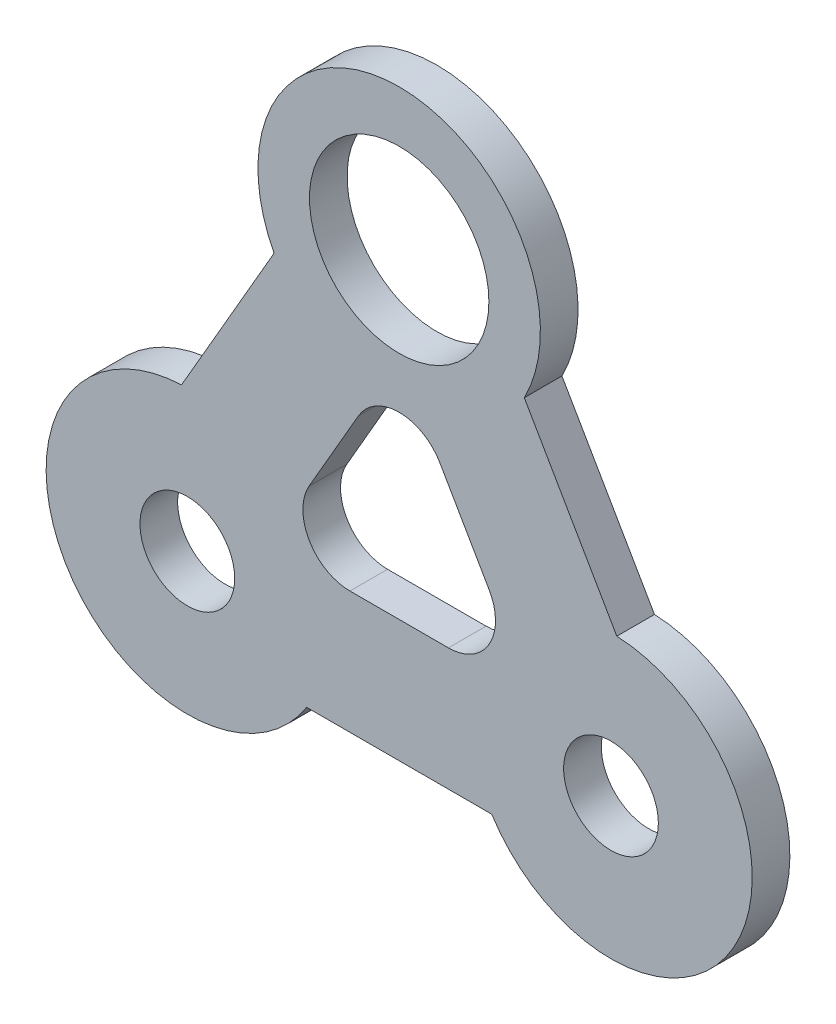
ISO-10303-21;
HEADER;
FILE_DESCRIPTION(('STEP AP214'),'2;1');
FILE_NAME('part.step','',(''),(''),'','','');
FILE_SCHEMA(('AUTOMOTIVE_DESIGN { 1 0 10303 214 1 1 1 1 }'));
ENDSEC;
DATA;
#1=APPLICATION_CONTEXT('core data for automotive mechanical design processes');
#2=APPLICATION_PROTOCOL_DEFINITION('international standard','automotive_design',2000,#1);
#3=PRODUCT_CONTEXT('',#1,'mechanical');
#4=PRODUCT('Part','Part','',(#3));
#5=PRODUCT_RELATED_PRODUCT_CATEGORY('part','',(#4));
#6=PRODUCT_DEFINITION_FORMATION('','',#4);
#7=PRODUCT_DEFINITION_CONTEXT('part definition',#1,'design');
#8=PRODUCT_DEFINITION('design','',#6,#7);
#9=PRODUCT_DEFINITION_SHAPE('','',#8);
#10=(LENGTH_UNIT() NAMED_UNIT(*) SI_UNIT(.MILLI.,.METRE.));
#11=(NAMED_UNIT(*) PLANE_ANGLE_UNIT() SI_UNIT($,.RADIAN.));
#12=(NAMED_UNIT(*) SI_UNIT($,.STERADIAN.) SOLID_ANGLE_UNIT());
#13=UNCERTAINTY_MEASURE_WITH_UNIT(LENGTH_MEASURE(1.E-05),#10,'distance_accuracy_value','');
#14=(GEOMETRIC_REPRESENTATION_CONTEXT(3) GLOBAL_UNCERTAINTY_ASSIGNED_CONTEXT((#13)) GLOBAL_UNIT_ASSIGNED_CONTEXT((#10,
#11,#12)) REPRESENTATION_CONTEXT('',''));
#15=CARTESIAN_POINT('',(0.,0.,0.));
#16=DIRECTION('',(0.,0.,1.));
#17=DIRECTION('',(1.,0.,0.));
#18=AXIS2_PLACEMENT_3D('',#15,#16,#17);
#19=CARTESIAN_POINT('',(-0.291428571428643,20.2141430137214,4.));
#20=DIRECTION('',(0.,0.,1.));
#21=DIRECTION('',(1.,0.,0.));
#22=AXIS2_PLACEMENT_3D('',#19,#20,#21);
#23=PLANE('',#22);
#24=CARTESIAN_POINT('',(22.2085714285714,-18.7570001565784,4.));
#25=DIRECTION('',(0.,0.,1.));
#26=DIRECTION('',(1.,0.,0.));
#27=AXIS2_PLACEMENT_3D('',#24,#25,#26);
#28=CIRCLE('',#27,5.03);
#29=CARTESIAN_POINT('',(27.2385714285714,-18.7570001565784,4.));
#30=VERTEX_POINT('',#29);
#31=EDGE_CURVE('E206',#30,#30,#28,.T.);
#32=ORIENTED_EDGE('',*,*,#31,.F.);
#33=EDGE_LOOP('',(#32));
#34=FACE_BOUND('',#33,.T.);
#35=DIRECTION('',(-0.500000000000004,-0.866025403784436,0.));
#36=VECTOR('',#35,1.);
#37=CARTESIAN_POINT('',(-18.4946225492973,4.74299984342158,4.));
#38=LINE('',#37,#36);
#39=CARTESIAN_POINT('',(-13.579791410665,13.2557370861542,4.));
#40=VERTEX_POINT('',#39);
#41=CARTESIAN_POINT('',(-23.4094536879295,-3.76973739931099,4.));
#42=VERTEX_POINT('',#41);
#43=EDGE_CURVE('E222',#40,#42,#38,.T.);
#44=ORIENTED_EDGE('',*,*,#43,.T.);
#45=CARTESIAN_POINT('',(-22.7914285714286,-18.7570001565784,4.));
#46=DIRECTION('',(0.,0.,1.));
#47=DIRECTION('',(-1.,0.,0.));
#48=AXIS2_PLACEMENT_3D('',#45,#46,#47);
#49=CIRCLE('',#48,15.);
#50=CARTESIAN_POINT('',(-10.1210908486931,-26.7858569862786,4.));
#51=VERTEX_POINT('',#50);
#52=EDGE_CURVE('E225',#42,#51,#49,.T.);
#53=ORIENTED_EDGE('',*,*,#52,.T.);
#54=DIRECTION('',(1.,0.,0.));
#55=VECTOR('',#54,1.);
#56=CARTESIAN_POINT('',(-0.291428571428633,-26.7858569862786,4.));
#57=LINE('',#56,#55);
#58=CARTESIAN_POINT('',(9.53823370583582,-26.7858569862786,4.));
#59=VERTEX_POINT('',#58);
#60=EDGE_CURVE('E229',#51,#59,#57,.T.);
#61=ORIENTED_EDGE('',*,*,#60,.T.);
#62=CARTESIAN_POINT('',(22.2085714285715,-18.7570001565784,4.));
#63=DIRECTION('',(0.,0.,1.));
#64=DIRECTION('',(-1.,0.,0.));
#65=AXIS2_PLACEMENT_3D('',#62,#63,#64);
#66=CIRCLE('',#65,15.0000000000001);
#67=CARTESIAN_POINT('',(22.8265965450723,-3.76973739931098,4.));
#68=VERTEX_POINT('',#67);
#69=EDGE_CURVE('E232',#59,#68,#66,.T.);
#70=ORIENTED_EDGE('',*,*,#69,.T.);
#71=DIRECTION('',(-0.500000000000005,0.866025403784436,0.));
#72=VECTOR('',#71,1.);
#73=CARTESIAN_POINT('',(17.91176540644,4.74299984342158,4.));
#74=LINE('',#73,#72);
#75=CARTESIAN_POINT('',(12.9969342678077,13.2557370861542,4.));
#76=VERTEX_POINT('',#75);
#77=EDGE_CURVE('E235',#68,#76,#74,.T.);
#78=ORIENTED_EDGE('',*,*,#77,.T.);
#79=CARTESIAN_POINT('',(-0.291428571428643,20.2141430137214,4.));
#80=DIRECTION('',(0.,0.,1.));
#81=DIRECTION('',(1.,0.,0.));
#82=AXIS2_PLACEMENT_3D('',#79,#80,#81);
#83=CIRCLE('',#82,15.);
#84=EDGE_CURVE('E238',#76,#40,#83,.T.);
#85=ORIENTED_EDGE('',*,*,#84,.T.);
#86=EDGE_LOOP('',(#44,#53,#61,#70,#78,#85));
#87=FACE_BOUND('',#86,.T.);
#88=CARTESIAN_POINT('',(-0.29142857142864,20.2141430137214,4.));
#89=DIRECTION('',(0.,0.,1.));
#90=DIRECTION('',(1.,0.,0.));
#91=AXIS2_PLACEMENT_3D('',#88,#89,#90);
#92=CIRCLE('',#91,9.53);
#93=CARTESIAN_POINT('',(9.23857142857136,20.2141430137214,4.));
#94=VERTEX_POINT('',#93);
#95=EDGE_CURVE('E214',#94,#94,#92,.T.);
#96=ORIENTED_EDGE('',*,*,#95,.F.);
#97=EDGE_LOOP('',(#96));
#98=FACE_BOUND('',#97,.T.);
#99=CARTESIAN_POINT('',(-22.7914285714286,-18.7570001565784,4.));
#100=DIRECTION('',(0.,0.,1.));
#101=DIRECTION('',(1.,0.,0.));
#102=AXIS2_PLACEMENT_3D('',#99,#100,#101);
#103=CIRCLE('',#102,5.03);
#104=CARTESIAN_POINT('',(-17.7614285714286,-18.7570001565784,4.));
#105=VERTEX_POINT('',#104);
#106=EDGE_CURVE('E198',#105,#105,#103,.T.);
#107=ORIENTED_EDGE('',*,*,#106,.F.);
#108=EDGE_LOOP('',(#107));
#109=FACE_BOUND('',#108,.T.);
#110=DIRECTION('',(-0.500000000000004,0.866025403784436,0.));
#111=VECTOR('',#110,1.);
#112=CARTESIAN_POINT('',(9.26817186699101,-6.28585698627862,4.));
#113=LINE('',#112,#111);
#114=CARTESIAN_POINT('',(9.26817186699101,-6.28585698627862,4.));
#115=VERTEX_POINT('',#114);
#116=CARTESIAN_POINT('',(4.03869844749354,2.77185667312186,4.));
#117=VERTEX_POINT('',#116);
#118=EDGE_CURVE('E138',#115,#117,#113,.T.);
#119=ORIENTED_EDGE('',*,*,#118,.F.);
#120=CARTESIAN_POINT('',(4.9380448480688,-8.78585698627862,4.));
#121=DIRECTION('',(0.,0.,1.));
#122=DIRECTION('',(1.,0.,0.));
#123=AXIS2_PLACEMENT_3D('',#120,#121,#122);
#124=CIRCLE('',#123,5.00000000000002);
#125=CARTESIAN_POINT('',(4.93804484806883,-13.7858569862786,4.));
#126=VERTEX_POINT('',#125);
#127=EDGE_CURVE('E129',#126,#115,#124,.T.);
#128=ORIENTED_EDGE('',*,*,#127,.F.);
#129=DIRECTION('',(1.,0.,0.));
#130=VECTOR('',#129,1.);
#131=CARTESIAN_POINT('',(4.93804484806883,-13.7858569862786,4.));
#132=LINE('',#131,#130);
#133=CARTESIAN_POINT('',(-5.52090199092611,-13.7858569862786,4.));
#134=VERTEX_POINT('',#133);
#135=EDGE_CURVE('E164',#134,#126,#132,.T.);
#136=ORIENTED_EDGE('',*,*,#135,.F.);
#137=CARTESIAN_POINT('',(-5.5209019909261,-8.78585698627863,4.));
#138=DIRECTION('',(0.,0.,1.));
#139=DIRECTION('',(-1.,0.,0.));
#140=AXIS2_PLACEMENT_3D('',#137,#138,#139);
#141=CIRCLE('',#140,5.);
#142=CARTESIAN_POINT('',(-9.85102900984829,-6.28585698627862,4.));
#143=VERTEX_POINT('',#142);
#144=EDGE_CURVE('E161',#143,#134,#141,.T.);
#145=ORIENTED_EDGE('',*,*,#144,.F.);
#146=DIRECTION('',(-0.500000000000004,-0.866025403784436,0.));
#147=VECTOR('',#146,1.);
#148=CARTESIAN_POINT('',(-4.62155559035082,2.77185667312185,4.));
#149=LINE('',#148,#147);
#150=CARTESIAN_POINT('',(-4.62155559035083,2.77185667312185,4.));
#151=VERTEX_POINT('',#150);
#152=EDGE_CURVE('E156',#151,#143,#149,.T.);
#153=ORIENTED_EDGE('',*,*,#152,.F.);
#154=CARTESIAN_POINT('',(-0.291428571428639,0.271856673121823,4.));
#155=DIRECTION('',(0.,0.,1.));
#156=DIRECTION('',(1.,0.,0.));
#157=AXIS2_PLACEMENT_3D('',#154,#155,#156);
#158=CIRCLE('',#157,5.00000000000001);
#159=EDGE_CURVE('E152',#117,#151,#158,.T.);
#160=ORIENTED_EDGE('',*,*,#159,.F.);
#161=EDGE_LOOP('',(#119,#128,#136,#145,#153,#160));
#162=FACE_BOUND('',#161,.T.);
#163=ADVANCED_FACE('F39',(#34,#87,#98,#109,#162),#23,.T.);
#164=CARTESIAN_POINT('',(-0.291428571428643,20.2141430137214,0.));
#165=DIRECTION('',(0.,0.,1.));
#166=DIRECTION('',(1.,0.,0.));
#167=AXIS2_PLACEMENT_3D('',#164,#165,#166);
#168=PLANE('',#167);
#169=CARTESIAN_POINT('',(-22.7914285714286,-18.7570001565784,0.));
#170=DIRECTION('',(0.,0.,1.));
#171=DIRECTION('',(1.,0.,0.));
#172=AXIS2_PLACEMENT_3D('',#169,#170,#171);
#173=CIRCLE('',#172,5.03);
#174=CARTESIAN_POINT('',(-17.7614285714286,-18.7570001565784,0.));
#175=VERTEX_POINT('',#174);
#176=EDGE_CURVE('E147',#175,#175,#173,.T.);
#177=ORIENTED_EDGE('',*,*,#176,.T.);
#178=EDGE_LOOP('',(#177));
#179=FACE_BOUND('',#178,.T.);
#180=CARTESIAN_POINT('',(22.2085714285714,-18.7570001565784,0.));
#181=DIRECTION('',(0.,0.,1.));
#182=DIRECTION('',(1.,0.,0.));
#183=AXIS2_PLACEMENT_3D('',#180,#181,#182);
#184=CIRCLE('',#183,5.03);
#185=CARTESIAN_POINT('',(27.2385714285714,-18.7570001565784,0.));
#186=VERTEX_POINT('',#185);
#187=EDGE_CURVE('E202',#186,#186,#184,.T.);
#188=ORIENTED_EDGE('',*,*,#187,.T.);
#189=EDGE_LOOP('',(#188));
#190=FACE_BOUND('',#189,.T.);
#191=CARTESIAN_POINT('',(-0.29142857142864,20.2141430137214,0.));
#192=DIRECTION('',(0.,0.,1.));
#193=DIRECTION('',(1.,0.,0.));
#194=AXIS2_PLACEMENT_3D('',#191,#192,#193);
#195=CIRCLE('',#194,9.53);
#196=CARTESIAN_POINT('',(9.23857142857136,20.2141430137214,0.));
#197=VERTEX_POINT('',#196);
#198=EDGE_CURVE('E210',#197,#197,#195,.T.);
#199=ORIENTED_EDGE('',*,*,#198,.T.);
#200=EDGE_LOOP('',(#199));
#201=FACE_BOUND('',#200,.T.);
#202=DIRECTION('',(-0.500000000000004,-0.866025403784436,0.));
#203=VECTOR('',#202,1.);
#204=CARTESIAN_POINT('',(-18.4946225492973,4.74299984342158,0.));
#205=LINE('',#204,#203);
#206=CARTESIAN_POINT('',(-13.579791410665,13.2557370861542,0.));
#207=VERTEX_POINT('',#206);
#208=CARTESIAN_POINT('',(-23.4094536879295,-3.76973739931099,0.));
#209=VERTEX_POINT('',#208);
#210=EDGE_CURVE('E218',#207,#209,#205,.T.);
#211=ORIENTED_EDGE('',*,*,#210,.F.);
#212=CARTESIAN_POINT('',(-0.291428571428643,20.2141430137214,0.));
#213=DIRECTION('',(0.,0.,1.));
#214=DIRECTION('',(1.,0.,0.));
#215=AXIS2_PLACEMENT_3D('',#212,#213,#214);
#216=CIRCLE('',#215,15.);
#217=CARTESIAN_POINT('',(12.9969342678077,13.2557370861542,0.));
#218=VERTEX_POINT('',#217);
#219=EDGE_CURVE('E226',#218,#207,#216,.T.);
#220=ORIENTED_EDGE('',*,*,#219,.F.);
#221=DIRECTION('',(-0.500000000000005,0.866025403784436,0.));
#222=VECTOR('',#221,1.);
#223=CARTESIAN_POINT('',(17.91176540644,4.74299984342158,0.));
#224=LINE('',#223,#222);
#225=CARTESIAN_POINT('',(22.8265965450723,-3.76973739931098,0.));
#226=VERTEX_POINT('',#225);
#227=EDGE_CURVE('E255',#226,#218,#224,.T.);
#228=ORIENTED_EDGE('',*,*,#227,.F.);
#229=CARTESIAN_POINT('',(22.2085714285715,-18.7570001565784,0.));
#230=DIRECTION('',(0.,0.,1.));
#231=DIRECTION('',(-1.,0.,0.));
#232=AXIS2_PLACEMENT_3D('',#229,#230,#231);
#233=CIRCLE('',#232,15.0000000000001);
#234=CARTESIAN_POINT('',(9.53823370583582,-26.7858569862786,0.));
#235=VERTEX_POINT('',#234);
#236=EDGE_CURVE('E251',#235,#226,#233,.T.);
#237=ORIENTED_EDGE('',*,*,#236,.F.);
#238=DIRECTION('',(1.,0.,0.));
#239=VECTOR('',#238,1.);
#240=CARTESIAN_POINT('',(-0.291428571428633,-26.7858569862786,0.));
#241=LINE('',#240,#239);
#242=CARTESIAN_POINT('',(-10.1210908486931,-26.7858569862786,0.));
#243=VERTEX_POINT('',#242);
#244=EDGE_CURVE('E248',#243,#235,#241,.T.);
#245=ORIENTED_EDGE('',*,*,#244,.F.);
#246=CARTESIAN_POINT('',(-22.7914285714286,-18.7570001565784,0.));
#247=DIRECTION('',(0.,0.,1.));
#248=DIRECTION('',(-1.,0.,0.));
#249=AXIS2_PLACEMENT_3D('',#246,#247,#248);
#250=CIRCLE('',#249,15.);
#251=EDGE_CURVE('E244',#209,#243,#250,.T.);
#252=ORIENTED_EDGE('',*,*,#251,.F.);
#253=EDGE_LOOP('',(#211,#220,#228,#237,#245,#252));
#254=FACE_BOUND('',#253,.T.);
#255=CARTESIAN_POINT('',(4.9380448480688,-8.78585698627862,0.));
#256=DIRECTION('',(0.,0.,1.));
#257=DIRECTION('',(1.,0.,0.));
#258=AXIS2_PLACEMENT_3D('',#255,#256,#257);
#259=CIRCLE('',#258,5.00000000000002);
#260=CARTESIAN_POINT('',(4.93804484806883,-13.7858569862786,0.));
#261=VERTEX_POINT('',#260);
#262=CARTESIAN_POINT('',(9.26817186699101,-6.28585698627862,0.));
#263=VERTEX_POINT('',#262);
#264=EDGE_CURVE('E63',#261,#263,#259,.T.);
#265=ORIENTED_EDGE('',*,*,#264,.T.);
#266=DIRECTION('',(-0.500000000000004,0.866025403784436,0.));
#267=VECTOR('',#266,1.);
#268=CARTESIAN_POINT('',(9.26817186699101,-6.28585698627862,0.));
#269=LINE('',#268,#267);
#270=CARTESIAN_POINT('',(4.03869844749354,2.77185667312186,0.));
#271=VERTEX_POINT('',#270);
#272=EDGE_CURVE('E145',#263,#271,#269,.T.);
#273=ORIENTED_EDGE('',*,*,#272,.T.);
#274=CARTESIAN_POINT('',(-0.291428571428639,0.271856673121823,0.));
#275=DIRECTION('',(0.,0.,1.));
#276=DIRECTION('',(1.,0.,0.));
#277=AXIS2_PLACEMENT_3D('',#274,#275,#276);
#278=CIRCLE('',#277,5.00000000000001);
#279=CARTESIAN_POINT('',(-4.62155559035083,2.77185667312185,0.));
#280=VERTEX_POINT('',#279);
#281=EDGE_CURVE('E171',#271,#280,#278,.T.);
#282=ORIENTED_EDGE('',*,*,#281,.T.);
#283=DIRECTION('',(-0.500000000000004,-0.866025403784436,0.));
#284=VECTOR('',#283,1.);
#285=CARTESIAN_POINT('',(-4.62155559035082,2.77185667312185,0.));
#286=LINE('',#285,#284);
#287=CARTESIAN_POINT('',(-9.85102900984829,-6.28585698627862,0.));
#288=VERTEX_POINT('',#287);
#289=EDGE_CURVE('E175',#280,#288,#286,.T.);
#290=ORIENTED_EDGE('',*,*,#289,.T.);
#291=CARTESIAN_POINT('',(-5.5209019909261,-8.78585698627863,0.));
#292=DIRECTION('',(0.,0.,1.));
#293=DIRECTION('',(-1.,0.,0.));
#294=AXIS2_PLACEMENT_3D('',#291,#292,#293);
#295=CIRCLE('',#294,5.);
#296=CARTESIAN_POINT('',(-5.52090199092611,-13.7858569862786,0.));
#297=VERTEX_POINT('',#296);
#298=EDGE_CURVE('E179',#288,#297,#295,.T.);
#299=ORIENTED_EDGE('',*,*,#298,.T.);
#300=DIRECTION('',(1.,0.,0.));
#301=VECTOR('',#300,1.);
#302=CARTESIAN_POINT('',(4.93804484806883,-13.7858569862786,0.));
#303=LINE('',#302,#301);
#304=EDGE_CURVE('E139',#297,#261,#303,.T.);
#305=ORIENTED_EDGE('',*,*,#304,.T.);
#306=EDGE_LOOP('',(#265,#273,#282,#290,#299,#305));
#307=FACE_BOUND('',#306,.T.);
#308=ADVANCED_FACE('F288',(#179,#190,#201,#254,#307),#168,.F.);
#309=CARTESIAN_POINT('',(-18.4946225492973,4.74299984342158,4.));
#310=DIRECTION('',(0.866025403784436,-0.500000000000004,0.));
#311=DIRECTION('',(0.500000000000004,0.866025403784436,0.));
#312=AXIS2_PLACEMENT_3D('',#309,#310,#311);
#313=PLANE('',#312);
#314=ORIENTED_EDGE('',*,*,#210,.T.);
#315=DIRECTION('',(0.,0.,-1.));
#316=VECTOR('',#315,1.);
#317=CARTESIAN_POINT('',(-23.4094536879295,-3.76973739931099,4.));
#318=LINE('',#317,#316);
#319=EDGE_CURVE('E11',#42,#209,#318,.T.);
#320=ORIENTED_EDGE('',*,*,#319,.F.);
#321=ORIENTED_EDGE('',*,*,#43,.F.);
#322=DIRECTION('',(0.,0.,-1.));
#323=VECTOR('',#322,1.);
#324=CARTESIAN_POINT('',(-13.579791410665,13.2557370861542,4.));
#325=LINE('',#324,#323);
#326=EDGE_CURVE('E241',#40,#207,#325,.T.);
#327=ORIENTED_EDGE('',*,*,#326,.T.);
#328=EDGE_LOOP('',(#314,#320,#321,#327));
#329=FACE_BOUND('',#328,.T.);
#330=ADVANCED_FACE('F41',(#329),#313,.F.);
#331=CARTESIAN_POINT('',(-22.7914285714286,-18.7570001565784,4.));
#332=DIRECTION('',(0.,0.,-1.));
#333=DIRECTION('',(-1.,0.,0.));
#334=AXIS2_PLACEMENT_3D('',#331,#332,#333);
#335=CYLINDRICAL_SURFACE('',#334,15.);
#336=ORIENTED_EDGE('',*,*,#251,.T.);
#337=DIRECTION('',(0.,0.,-1.));
#338=VECTOR('',#337,1.);
#339=CARTESIAN_POINT('',(-10.1210908486931,-26.7858569862786,4.));
#340=LINE('',#339,#338);
#341=EDGE_CURVE('E48',#51,#243,#340,.T.);
#342=ORIENTED_EDGE('',*,*,#341,.F.);
#343=ORIENTED_EDGE('',*,*,#52,.F.);
#344=ORIENTED_EDGE('',*,*,#319,.T.);
#345=EDGE_LOOP('',(#336,#342,#343,#344));
#346=FACE_BOUND('',#345,.T.);
#347=ADVANCED_FACE('F284',(#346),#335,.T.);
#348=CARTESIAN_POINT('',(-0.291428571428633,-26.7858569862786,4.));
#349=DIRECTION('',(0.,1.,0.));
#350=DIRECTION('',(0.,0.,1.));
#351=AXIS2_PLACEMENT_3D('',#348,#349,#350);
#352=PLANE('',#351);
#353=ORIENTED_EDGE('',*,*,#244,.T.);
#354=DIRECTION('',(0.,0.,-1.));
#355=VECTOR('',#354,1.);
#356=CARTESIAN_POINT('',(9.53823370583582,-26.7858569862786,4.));
#357=LINE('',#356,#355);
#358=EDGE_CURVE('E272',#59,#235,#357,.T.);
#359=ORIENTED_EDGE('',*,*,#358,.F.);
#360=ORIENTED_EDGE('',*,*,#60,.F.);
#361=ORIENTED_EDGE('',*,*,#341,.T.);
#362=EDGE_LOOP('',(#353,#359,#360,#361));
#363=FACE_BOUND('',#362,.T.);
#364=ADVANCED_FACE('F280',(#363),#352,.F.);
#365=CARTESIAN_POINT('',(22.2085714285715,-18.7570001565784,4.));
#366=DIRECTION('',(0.,0.,-1.));
#367=DIRECTION('',(-1.,0.,0.));
#368=AXIS2_PLACEMENT_3D('',#365,#366,#367);
#369=CYLINDRICAL_SURFACE('',#368,15.0000000000001);
#370=ORIENTED_EDGE('',*,*,#236,.T.);
#371=DIRECTION('',(0.,0.,-1.));
#372=VECTOR('',#371,1.);
#373=CARTESIAN_POINT('',(22.8265965450723,-3.76973739931098,4.));
#374=LINE('',#373,#372);
#375=EDGE_CURVE('E268',#68,#226,#374,.T.);
#376=ORIENTED_EDGE('',*,*,#375,.F.);
#377=ORIENTED_EDGE('',*,*,#69,.F.);
#378=ORIENTED_EDGE('',*,*,#358,.T.);
#379=EDGE_LOOP('',(#370,#376,#377,#378));
#380=FACE_BOUND('',#379,.T.);
#381=ADVANCED_FACE('F294',(#380),#369,.T.);
#382=CARTESIAN_POINT('',(17.91176540644,4.74299984342158,4.));
#383=DIRECTION('',(-0.866025403784436,-0.500000000000005,0.));
#384=DIRECTION('',(0.500000000000005,-0.866025403784436,0.));
#385=AXIS2_PLACEMENT_3D('',#382,#383,#384);
#386=PLANE('',#385);
#387=ORIENTED_EDGE('',*,*,#227,.T.);
#388=DIRECTION('',(0.,0.,-1.));
#389=VECTOR('',#388,1.);
#390=CARTESIAN_POINT('',(12.9969342678077,13.2557370861542,4.));
#391=LINE('',#390,#389);
#392=EDGE_CURVE('E264',#76,#218,#391,.T.);
#393=ORIENTED_EDGE('',*,*,#392,.F.);
#394=ORIENTED_EDGE('',*,*,#77,.F.);
#395=ORIENTED_EDGE('',*,*,#375,.T.);
#396=EDGE_LOOP('',(#387,#393,#394,#395));
#397=FACE_BOUND('',#396,.T.);
#398=ADVANCED_FACE('F298',(#397),#386,.F.);
#399=CARTESIAN_POINT('',(-0.291428571428643,20.2141430137214,4.));
#400=DIRECTION('',(0.,0.,-1.));
#401=DIRECTION('',(-1.,0.,0.));
#402=AXIS2_PLACEMENT_3D('',#399,#400,#401);
#403=CYLINDRICAL_SURFACE('',#402,15.);
#404=ORIENTED_EDGE('',*,*,#219,.T.);
#405=ORIENTED_EDGE('',*,*,#326,.F.);
#406=ORIENTED_EDGE('',*,*,#84,.F.);
#407=ORIENTED_EDGE('',*,*,#392,.T.);
#408=EDGE_LOOP('',(#404,#405,#406,#407));
#409=FACE_BOUND('',#408,.T.);
#410=ADVANCED_FACE('F307',(#409),#403,.T.);
#411=CARTESIAN_POINT('',(-0.29142857142864,20.2141430137214,4.));
#412=DIRECTION('',(0.,0.,-1.));
#413=DIRECTION('',(-1.,0.,0.));
#414=AXIS2_PLACEMENT_3D('',#411,#412,#413);
#415=CYLINDRICAL_SURFACE('',#414,9.53);
#416=ORIENTED_EDGE('',*,*,#95,.T.);
#417=EDGE_LOOP('',(#416));
#418=FACE_BOUND('',#417,.T.);
#419=ORIENTED_EDGE('',*,*,#198,.F.);
#420=EDGE_LOOP('',(#419));
#421=FACE_BOUND('',#420,.T.);
#422=ADVANCED_FACE('F309',(#418,#421),#415,.F.);
#423=CARTESIAN_POINT('',(22.2085714285714,-18.7570001565784,4.));
#424=DIRECTION('',(0.,0.,-1.));
#425=DIRECTION('',(-1.,0.,0.));
#426=AXIS2_PLACEMENT_3D('',#423,#424,#425);
#427=CYLINDRICAL_SURFACE('',#426,5.03);
#428=ORIENTED_EDGE('',*,*,#31,.T.);
#429=EDGE_LOOP('',(#428));
#430=FACE_BOUND('',#429,.T.);
#431=ORIENTED_EDGE('',*,*,#187,.F.);
#432=EDGE_LOOP('',(#431));
#433=FACE_BOUND('',#432,.T.);
#434=ADVANCED_FACE('F315',(#430,#433),#427,.F.);
#435=CARTESIAN_POINT('',(-22.7914285714286,-18.7570001565784,4.));
#436=DIRECTION('',(0.,0.,-1.));
#437=DIRECTION('',(-1.,0.,0.));
#438=AXIS2_PLACEMENT_3D('',#435,#436,#437);
#439=CYLINDRICAL_SURFACE('',#438,5.03);
#440=ORIENTED_EDGE('',*,*,#106,.T.);
#441=EDGE_LOOP('',(#440));
#442=FACE_BOUND('',#441,.T.);
#443=ORIENTED_EDGE('',*,*,#176,.F.);
#444=EDGE_LOOP('',(#443));
#445=FACE_BOUND('',#444,.T.);
#446=ADVANCED_FACE('F331',(#442,#445),#439,.F.);
#447=CARTESIAN_POINT('',(4.9380448480688,-8.78585698627862,4.));
#448=DIRECTION('',(0.,0.,-1.));
#449=DIRECTION('',(-1.,0.,0.));
#450=AXIS2_PLACEMENT_3D('',#447,#448,#449);
#451=CYLINDRICAL_SURFACE('',#450,5.00000000000002);
#452=ORIENTED_EDGE('',*,*,#264,.F.);
#453=DIRECTION('',(0.,0.,-1.));
#454=VECTOR('',#453,1.);
#455=CARTESIAN_POINT('',(4.93804484806883,-13.7858569862786,4.));
#456=LINE('',#455,#454);
#457=EDGE_CURVE('E133',#126,#261,#456,.T.);
#458=ORIENTED_EDGE('',*,*,#457,.F.);
#459=ORIENTED_EDGE('',*,*,#127,.T.);
#460=DIRECTION('',(0.,0.,-1.));
#461=VECTOR('',#460,1.);
#462=CARTESIAN_POINT('',(9.26817186699101,-6.28585698627862,4.));
#463=LINE('',#462,#461);
#464=EDGE_CURVE('E132',#115,#263,#463,.T.);
#465=ORIENTED_EDGE('',*,*,#464,.T.);
#466=EDGE_LOOP('',(#452,#458,#459,#465));
#467=FACE_BOUND('',#466,.T.);
#468=ADVANCED_FACE('F131',(#467),#451,.F.);
#469=CARTESIAN_POINT('',(9.26817186699101,-6.28585698627862,4.));
#470=DIRECTION('',(-0.866025403784436,-0.500000000000004,0.));
#471=DIRECTION('',(0.500000000000004,-0.866025403784437,0.));
#472=AXIS2_PLACEMENT_3D('',#469,#470,#471);
#473=PLANE('',#472);
#474=ORIENTED_EDGE('',*,*,#272,.F.);
#475=ORIENTED_EDGE('',*,*,#464,.F.);
#476=ORIENTED_EDGE('',*,*,#118,.T.);
#477=DIRECTION('',(0.,0.,-1.));
#478=VECTOR('',#477,1.);
#479=CARTESIAN_POINT('',(4.03869844749354,2.77185667312186,4.));
#480=LINE('',#479,#478);
#481=EDGE_CURVE('E148',#117,#271,#480,.T.);
#482=ORIENTED_EDGE('',*,*,#481,.T.);
#483=EDGE_LOOP('',(#474,#475,#476,#482));
#484=FACE_BOUND('',#483,.T.);
#485=ADVANCED_FACE('F142',(#484),#473,.T.);
#486=CARTESIAN_POINT('',(-0.291428571428639,0.271856673121823,4.));
#487=DIRECTION('',(0.,0.,-1.));
#488=DIRECTION('',(-1.,0.,0.));
#489=AXIS2_PLACEMENT_3D('',#486,#487,#488);
#490=CYLINDRICAL_SURFACE('',#489,5.00000000000001);
#491=ORIENTED_EDGE('',*,*,#281,.F.);
#492=ORIENTED_EDGE('',*,*,#481,.F.);
#493=ORIENTED_EDGE('',*,*,#159,.T.);
#494=DIRECTION('',(0.,0.,-1.));
#495=VECTOR('',#494,1.);
#496=CARTESIAN_POINT('',(-4.62155559035083,2.77185667312185,4.));
#497=LINE('',#496,#495);
#498=EDGE_CURVE('E193',#151,#280,#497,.T.);
#499=ORIENTED_EDGE('',*,*,#498,.T.);
#500=EDGE_LOOP('',(#491,#492,#493,#499));
#501=FACE_BOUND('',#500,.T.);
#502=ADVANCED_FACE('F340',(#501),#490,.F.);
#503=CARTESIAN_POINT('',(-4.62155559035082,2.77185667312185,4.));
#504=DIRECTION('',(0.866025403784436,-0.500000000000004,0.));
#505=DIRECTION('',(0.500000000000004,0.866025403784437,0.));
#506=AXIS2_PLACEMENT_3D('',#503,#504,#505);
#507=PLANE('',#506);
#508=ORIENTED_EDGE('',*,*,#289,.F.);
#509=ORIENTED_EDGE('',*,*,#498,.F.);
#510=ORIENTED_EDGE('',*,*,#152,.T.);
#511=DIRECTION('',(0.,0.,-1.));
#512=VECTOR('',#511,1.);
#513=CARTESIAN_POINT('',(-9.85102900984829,-6.28585698627862,4.));
#514=LINE('',#513,#512);
#515=EDGE_CURVE('E190',#143,#288,#514,.T.);
#516=ORIENTED_EDGE('',*,*,#515,.T.);
#517=EDGE_LOOP('',(#508,#509,#510,#516));
#518=FACE_BOUND('',#517,.T.);
#519=ADVANCED_FACE('F343',(#518),#507,.T.);
#520=CARTESIAN_POINT('',(-5.5209019909261,-8.78585698627863,4.));
#521=DIRECTION('',(0.,0.,-1.));
#522=DIRECTION('',(-1.,0.,0.));
#523=AXIS2_PLACEMENT_3D('',#520,#521,#522);
#524=CYLINDRICAL_SURFACE('',#523,5.);
#525=ORIENTED_EDGE('',*,*,#298,.F.);
#526=ORIENTED_EDGE('',*,*,#515,.F.);
#527=ORIENTED_EDGE('',*,*,#144,.T.);
#528=DIRECTION('',(0.,0.,-1.));
#529=VECTOR('',#528,1.);
#530=CARTESIAN_POINT('',(-5.52090199092611,-13.7858569862786,4.));
#531=LINE('',#530,#529);
#532=EDGE_CURVE('E55',#134,#297,#531,.T.);
#533=ORIENTED_EDGE('',*,*,#532,.T.);
#534=EDGE_LOOP('',(#525,#526,#527,#533));
#535=FACE_BOUND('',#534,.T.);
#536=ADVANCED_FACE('F347',(#535),#524,.F.);
#537=CARTESIAN_POINT('',(4.93804484806883,-13.7858569862786,4.));
#538=DIRECTION('',(0.,1.,0.));
#539=DIRECTION('',(0.,0.,1.));
#540=AXIS2_PLACEMENT_3D('',#537,#538,#539);
#541=PLANE('',#540);
#542=ORIENTED_EDGE('',*,*,#304,.F.);
#543=ORIENTED_EDGE('',*,*,#532,.F.);
#544=ORIENTED_EDGE('',*,*,#135,.T.);
#545=ORIENTED_EDGE('',*,*,#457,.T.);
#546=EDGE_LOOP('',(#542,#543,#544,#545));
#547=FACE_BOUND('',#546,.T.);
#548=ADVANCED_FACE('F351',(#547),#541,.T.);
#549=CLOSED_SHELL('',(#163,#308,#330,#347,#364,#381,#398,#410,#422,#434,#446,#468,#485,#502,
#519,#536,#548));
#550=MANIFOLD_SOLID_BREP('B2',#549);
#551=ADVANCED_BREP_SHAPE_REPRESENTATION('',(#18,#550),#14);
#552=SHAPE_DEFINITION_REPRESENTATION(#9,#551);
ENDSEC;
END-ISO-10303-21;
